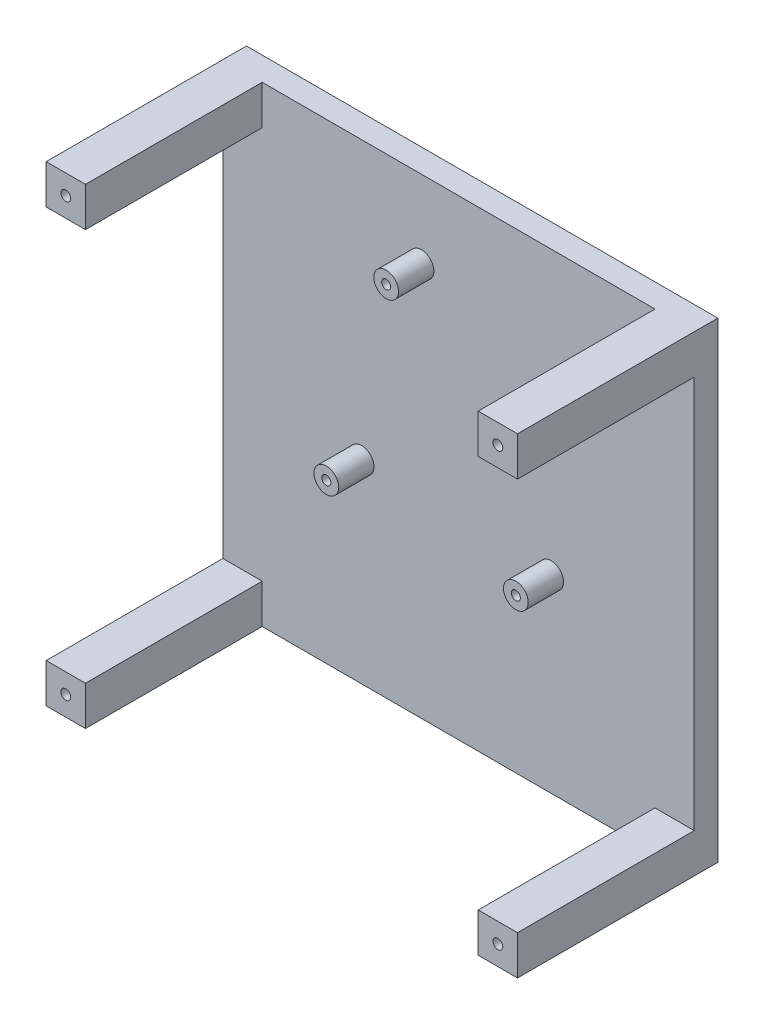
ISO-10303-21;
HEADER;
FILE_DESCRIPTION(('STEP AP214'),'2;1');
FILE_NAME('part.step','',(''),(''),'','','');
FILE_SCHEMA(('AUTOMOTIVE_DESIGN { 1 0 10303 214 1 1 1 1 }'));
ENDSEC;
DATA;
#1=APPLICATION_CONTEXT('core data for automotive mechanical design processes');
#2=APPLICATION_PROTOCOL_DEFINITION('international standard','automotive_design',2000,#1);
#3=PRODUCT_CONTEXT('',#1,'mechanical');
#4=PRODUCT('Part','Part','',(#3));
#5=PRODUCT_RELATED_PRODUCT_CATEGORY('part','',(#4));
#6=PRODUCT_DEFINITION_FORMATION('','',#4);
#7=PRODUCT_DEFINITION_CONTEXT('part definition',#1,'design');
#8=PRODUCT_DEFINITION('design','',#6,#7);
#9=PRODUCT_DEFINITION_SHAPE('','',#8);
#10=(LENGTH_UNIT() NAMED_UNIT(*) SI_UNIT(.MILLI.,.METRE.));
#11=(NAMED_UNIT(*) PLANE_ANGLE_UNIT() SI_UNIT($,.RADIAN.));
#12=(NAMED_UNIT(*) SI_UNIT($,.STERADIAN.) SOLID_ANGLE_UNIT());
#13=UNCERTAINTY_MEASURE_WITH_UNIT(LENGTH_MEASURE(1.E-05),#10,'distance_accuracy_value','');
#14=(GEOMETRIC_REPRESENTATION_CONTEXT(3) GLOBAL_UNCERTAINTY_ASSIGNED_CONTEXT((#13)) GLOBAL_UNIT_ASSIGNED_CONTEXT((#10,
#11,#12)) REPRESENTATION_CONTEXT('',''));
#15=CARTESIAN_POINT('',(0.,0.,0.));
#16=DIRECTION('',(0.,0.,1.));
#17=DIRECTION('',(1.,0.,0.));
#18=AXIS2_PLACEMENT_3D('',#15,#16,#17);
#19=CARTESIAN_POINT('',(0.,0.,6.));
#20=DIRECTION('',(0.,0.,-1.));
#21=DIRECTION('',(-1.,0.,0.));
#22=AXIS2_PLACEMENT_3D('',#19,#20,#21);
#23=PLANE('',#22);
#24=CARTESIAN_POINT('',(-9.44055671550319,40.2161245033507,6.));
#25=DIRECTION('',(0.,0.,-1.));
#26=DIRECTION('',(-1.,0.,0.));
#27=AXIS2_PLACEMENT_3D('',#24,#25,#26);
#28=CIRCLE('',#27,3.15);
#29=CARTESIAN_POINT('',(-12.5905567155032,40.2161245033507,6.));
#30=VERTEX_POINT('',#29);
#31=EDGE_CURVE('E11',#30,#30,#28,.F.);
#32=ORIENTED_EDGE('',*,*,#31,.F.);
#33=EDGE_LOOP('',(#32));
#34=FACE_BOUND('',#33,.T.);
#35=CARTESIAN_POINT('',(23.5794432844968,-11.8538754966493,6.));
#36=DIRECTION('',(0.,0.,-1.));
#37=DIRECTION('',(-1.,0.,0.));
#38=AXIS2_PLACEMENT_3D('',#35,#36,#37);
#39=CIRCLE('',#38,3.15);
#40=CARTESIAN_POINT('',(20.4294432844968,-11.8538754966493,6.));
#41=VERTEX_POINT('',#40);
#42=EDGE_CURVE('E54',#41,#41,#39,.F.);
#43=ORIENTED_EDGE('',*,*,#42,.F.);
#44=EDGE_LOOP('',(#43));
#45=FACE_BOUND('',#44,.T.);
#46=CARTESIAN_POINT('',(-24.6805567155027,-10.5838754966493,6.));
#47=DIRECTION('',(0.,0.,-1.));
#48=DIRECTION('',(-1.,0.,0.));
#49=AXIS2_PLACEMENT_3D('',#46,#47,#48);
#50=CIRCLE('',#49,3.15);
#51=CARTESIAN_POINT('',(-27.8305567155027,-10.5838754966493,6.));
#52=VERTEX_POINT('',#51);
#53=EDGE_CURVE('E292',#52,#52,#50,.F.);
#54=ORIENTED_EDGE('',*,*,#53,.F.);
#55=EDGE_LOOP('',(#54));
#56=FACE_BOUND('',#55,.T.);
#57=DIRECTION('',(-1.,0.,0.));
#58=VECTOR('',#57,1.);
#59=CARTESIAN_POINT('',(-60.,-50.,6.));
#60=LINE('',#59,#58);
#61=CARTESIAN_POINT('',(-50.,-50.,6.));
#62=VERTEX_POINT('',#61);
#63=CARTESIAN_POINT('',(-60.,-50.,6.));
#64=VERTEX_POINT('',#63);
#65=EDGE_CURVE('E228',#62,#64,#60,.T.);
#66=ORIENTED_EDGE('',*,*,#65,.F.);
#67=DIRECTION('',(0.,1.,0.));
#68=VECTOR('',#67,1.);
#69=CARTESIAN_POINT('',(-50.,-60.,6.));
#70=LINE('',#69,#68);
#71=CARTESIAN_POINT('',(-50.,-60.,6.));
#72=VERTEX_POINT('',#71);
#73=EDGE_CURVE('E192',#72,#62,#70,.T.);
#74=ORIENTED_EDGE('',*,*,#73,.F.);
#75=DIRECTION('',(1.,0.,0.));
#76=VECTOR('',#75,1.);
#77=CARTESIAN_POINT('',(60.,-60.,6.));
#78=LINE('',#77,#76);
#79=CARTESIAN_POINT('',(50.,-60.,6.));
#80=VERTEX_POINT('',#79);
#81=EDGE_CURVE('E268',#72,#80,#78,.T.);
#82=ORIENTED_EDGE('',*,*,#81,.T.);
#83=DIRECTION('',(0.,-1.,0.));
#84=VECTOR('',#83,1.);
#85=CARTESIAN_POINT('',(50.,-60.,6.));
#86=LINE('',#85,#84);
#87=CARTESIAN_POINT('',(50.,-50.,6.));
#88=VERTEX_POINT('',#87);
#89=EDGE_CURVE('E204',#88,#80,#86,.T.);
#90=ORIENTED_EDGE('',*,*,#89,.F.);
#91=DIRECTION('',(-1.,0.,0.));
#92=VECTOR('',#91,1.);
#93=CARTESIAN_POINT('',(60.,-50.,6.));
#94=LINE('',#93,#92);
#95=CARTESIAN_POINT('',(60.,-50.,6.));
#96=VERTEX_POINT('',#95);
#97=EDGE_CURVE('E70',#96,#88,#94,.T.);
#98=ORIENTED_EDGE('',*,*,#97,.F.);
#99=DIRECTION('',(0.,1.,0.));
#100=VECTOR('',#99,1.);
#101=CARTESIAN_POINT('',(60.,-60.,6.));
#102=LINE('',#101,#100);
#103=CARTESIAN_POINT('',(60.,50.,6.));
#104=VERTEX_POINT('',#103);
#105=EDGE_CURVE('E61',#96,#104,#102,.T.);
#106=ORIENTED_EDGE('',*,*,#105,.T.);
#107=DIRECTION('',(1.,0.,0.));
#108=VECTOR('',#107,1.);
#109=CARTESIAN_POINT('',(60.,50.,6.));
#110=LINE('',#109,#108);
#111=CARTESIAN_POINT('',(50.,50.,6.));
#112=VERTEX_POINT('',#111);
#113=EDGE_CURVE('E153',#112,#104,#110,.T.);
#114=ORIENTED_EDGE('',*,*,#113,.F.);
#115=DIRECTION('',(0.,-1.,0.));
#116=VECTOR('',#115,1.);
#117=CARTESIAN_POINT('',(50.,60.,6.));
#118=LINE('',#117,#116);
#119=CARTESIAN_POINT('',(50.,60.,6.));
#120=VERTEX_POINT('',#119);
#121=EDGE_CURVE('E159',#120,#112,#118,.T.);
#122=ORIENTED_EDGE('',*,*,#121,.F.);
#123=DIRECTION('',(-1.,0.,0.));
#124=VECTOR('',#123,1.);
#125=CARTESIAN_POINT('',(60.,60.,6.));
#126=LINE('',#125,#124);
#127=CARTESIAN_POINT('',(-50.,60.,6.));
#128=VERTEX_POINT('',#127);
#129=EDGE_CURVE('E263',#120,#128,#126,.T.);
#130=ORIENTED_EDGE('',*,*,#129,.T.);
#131=DIRECTION('',(0.,1.,0.));
#132=VECTOR('',#131,1.);
#133=CARTESIAN_POINT('',(-50.,60.,6.));
#134=LINE('',#133,#132);
#135=CARTESIAN_POINT('',(-50.,50.,6.));
#136=VERTEX_POINT('',#135);
#137=EDGE_CURVE('E242',#136,#128,#134,.T.);
#138=ORIENTED_EDGE('',*,*,#137,.F.);
#139=DIRECTION('',(1.,0.,0.));
#140=VECTOR('',#139,1.);
#141=CARTESIAN_POINT('',(-60.,50.,6.));
#142=LINE('',#141,#140);
#143=CARTESIAN_POINT('',(-60.,50.,6.));
#144=VERTEX_POINT('',#143);
#145=EDGE_CURVE('E173',#144,#136,#142,.T.);
#146=ORIENTED_EDGE('',*,*,#145,.F.);
#147=DIRECTION('',(0.,-1.,0.));
#148=VECTOR('',#147,1.);
#149=CARTESIAN_POINT('',(-60.,-60.,6.));
#150=LINE('',#149,#148);
#151=EDGE_CURVE('E269',#144,#64,#150,.T.);
#152=ORIENTED_EDGE('',*,*,#151,.T.);
#153=EDGE_LOOP('',(#66,#74,#82,#90,#98,#106,#114,#122,#130,#138,#146,#152));
#154=FACE_BOUND('',#153,.T.);
#155=ADVANCED_FACE('F50',(#34,#45,#56,#154),#23,.F.);
#156=CARTESIAN_POINT('',(60.,60.,6.));
#157=DIRECTION('',(0.,-1.,0.));
#158=DIRECTION('',(0.,0.,-1.));
#159=AXIS2_PLACEMENT_3D('',#156,#157,#158);
#160=PLANE('',#159);
#161=DIRECTION('',(-1.,0.,0.));
#162=VECTOR('',#161,1.);
#163=CARTESIAN_POINT('',(60.,60.,0.));
#164=LINE('',#163,#162);
#165=CARTESIAN_POINT('',(60.,60.,0.));
#166=VERTEX_POINT('',#165);
#167=CARTESIAN_POINT('',(-60.,60.,0.));
#168=VERTEX_POINT('',#167);
#169=EDGE_CURVE('E261',#166,#168,#164,.T.);
#170=ORIENTED_EDGE('',*,*,#169,.T.);
#171=DIRECTION('',(0.,0.,-1.));
#172=VECTOR('',#171,1.);
#173=CARTESIAN_POINT('',(-60.,60.,6.));
#174=LINE('',#173,#172);
#175=CARTESIAN_POINT('',(-60.,60.,51.));
#176=VERTEX_POINT('',#175);
#177=EDGE_CURVE('E286',#176,#168,#174,.T.);
#178=ORIENTED_EDGE('',*,*,#177,.F.);
#179=DIRECTION('',(-1.,0.,0.));
#180=VECTOR('',#179,1.);
#181=CARTESIAN_POINT('',(-60.,60.,51.));
#182=LINE('',#181,#180);
#183=CARTESIAN_POINT('',(-50.,60.,51.));
#184=VERTEX_POINT('',#183);
#185=EDGE_CURVE('E247',#184,#176,#182,.T.);
#186=ORIENTED_EDGE('',*,*,#185,.F.);
#187=DIRECTION('',(0.,0.,-1.));
#188=VECTOR('',#187,1.);
#189=CARTESIAN_POINT('',(-50.,60.,51.));
#190=LINE('',#189,#188);
#191=EDGE_CURVE('E252',#184,#128,#190,.T.);
#192=ORIENTED_EDGE('',*,*,#191,.T.);
#193=ORIENTED_EDGE('',*,*,#129,.F.);
#194=DIRECTION('',(0.,0.,-1.));
#195=VECTOR('',#194,1.);
#196=CARTESIAN_POINT('',(50.,60.,51.));
#197=LINE('',#196,#195);
#198=CARTESIAN_POINT('',(50.,60.,51.));
#199=VERTEX_POINT('',#198);
#200=EDGE_CURVE('E175',#199,#120,#197,.T.);
#201=ORIENTED_EDGE('',*,*,#200,.F.);
#202=DIRECTION('',(-1.,0.,0.));
#203=VECTOR('',#202,1.);
#204=CARTESIAN_POINT('',(60.,60.,51.));
#205=LINE('',#204,#203);
#206=CARTESIAN_POINT('',(60.,60.,51.));
#207=VERTEX_POINT('',#206);
#208=EDGE_CURVE('E161',#207,#199,#205,.T.);
#209=ORIENTED_EDGE('',*,*,#208,.F.);
#210=DIRECTION('',(0.,0.,-1.));
#211=VECTOR('',#210,1.);
#212=CARTESIAN_POINT('',(60.,60.,6.));
#213=LINE('',#212,#211);
#214=EDGE_CURVE('E271',#207,#166,#213,.T.);
#215=ORIENTED_EDGE('',*,*,#214,.T.);
#216=EDGE_LOOP('',(#170,#178,#186,#192,#193,#201,#209,#215));
#217=FACE_BOUND('',#216,.T.);
#218=ADVANCED_FACE('F47',(#217),#160,.F.);
#219=CARTESIAN_POINT('',(-60.,-60.,6.));
#220=DIRECTION('',(1.,0.,0.));
#221=DIRECTION('',(0.,0.,-1.));
#222=AXIS2_PLACEMENT_3D('',#219,#220,#221);
#223=PLANE('',#222);
#224=DIRECTION('',(0.,-1.,0.));
#225=VECTOR('',#224,1.);
#226=CARTESIAN_POINT('',(-60.,-60.,0.));
#227=LINE('',#226,#225);
#228=CARTESIAN_POINT('',(-60.,-60.,0.));
#229=VERTEX_POINT('',#228);
#230=EDGE_CURVE('E279',#168,#229,#227,.T.);
#231=ORIENTED_EDGE('',*,*,#230,.T.);
#232=DIRECTION('',(0.,0.,-1.));
#233=VECTOR('',#232,1.);
#234=CARTESIAN_POINT('',(-60.,-60.,6.));
#235=LINE('',#234,#233);
#236=CARTESIAN_POINT('',(-60.,-60.,51.));
#237=VERTEX_POINT('',#236);
#238=EDGE_CURVE('E287',#237,#229,#235,.T.);
#239=ORIENTED_EDGE('',*,*,#238,.F.);
#240=DIRECTION('',(0.,-1.,0.));
#241=VECTOR('',#240,1.);
#242=CARTESIAN_POINT('',(-60.,-60.,51.));
#243=LINE('',#242,#241);
#244=CARTESIAN_POINT('',(-60.,-50.,51.));
#245=VERTEX_POINT('',#244);
#246=EDGE_CURVE('E223',#245,#237,#243,.T.);
#247=ORIENTED_EDGE('',*,*,#246,.F.);
#248=DIRECTION('',(0.,0.,-1.));
#249=VECTOR('',#248,1.);
#250=CARTESIAN_POINT('',(-60.,-50.,51.));
#251=LINE('',#250,#249);
#252=EDGE_CURVE('E224',#245,#64,#251,.T.);
#253=ORIENTED_EDGE('',*,*,#252,.T.);
#254=ORIENTED_EDGE('',*,*,#151,.F.);
#255=DIRECTION('',(0.,0.,-1.));
#256=VECTOR('',#255,1.);
#257=CARTESIAN_POINT('',(-60.,50.,51.));
#258=LINE('',#257,#256);
#259=CARTESIAN_POINT('',(-60.,50.,51.));
#260=VERTEX_POINT('',#259);
#261=EDGE_CURVE('E262',#260,#144,#258,.T.);
#262=ORIENTED_EDGE('',*,*,#261,.F.);
#263=DIRECTION('',(0.,-1.,0.));
#264=VECTOR('',#263,1.);
#265=CARTESIAN_POINT('',(-60.,60.,51.));
#266=LINE('',#265,#264);
#267=EDGE_CURVE('E239',#176,#260,#266,.T.);
#268=ORIENTED_EDGE('',*,*,#267,.F.);
#269=ORIENTED_EDGE('',*,*,#177,.T.);
#270=EDGE_LOOP('',(#231,#239,#247,#253,#254,#262,#268,#269));
#271=FACE_BOUND('',#270,.T.);
#272=ADVANCED_FACE('F406',(#271),#223,.F.);
#273=CARTESIAN_POINT('',(60.,-60.,6.));
#274=DIRECTION('',(0.,1.,0.));
#275=DIRECTION('',(0.,0.,1.));
#276=AXIS2_PLACEMENT_3D('',#273,#274,#275);
#277=PLANE('',#276);
#278=DIRECTION('',(1.,0.,0.));
#279=VECTOR('',#278,1.);
#280=CARTESIAN_POINT('',(60.,-60.,0.));
#281=LINE('',#280,#279);
#282=CARTESIAN_POINT('',(60.,-60.,0.));
#283=VERTEX_POINT('',#282);
#284=EDGE_CURVE('E280',#229,#283,#281,.T.);
#285=ORIENTED_EDGE('',*,*,#284,.T.);
#286=DIRECTION('',(0.,0.,-1.));
#287=VECTOR('',#286,1.);
#288=CARTESIAN_POINT('',(60.,-60.,6.));
#289=LINE('',#288,#287);
#290=CARTESIAN_POINT('',(60.,-60.,51.));
#291=VERTEX_POINT('',#290);
#292=EDGE_CURVE('E284',#291,#283,#289,.T.);
#293=ORIENTED_EDGE('',*,*,#292,.F.);
#294=DIRECTION('',(1.,0.,0.));
#295=VECTOR('',#294,1.);
#296=CARTESIAN_POINT('',(60.,-60.,51.));
#297=LINE('',#296,#295);
#298=CARTESIAN_POINT('',(50.,-60.,51.));
#299=VERTEX_POINT('',#298);
#300=EDGE_CURVE('E202',#299,#291,#297,.T.);
#301=ORIENTED_EDGE('',*,*,#300,.F.);
#302=DIRECTION('',(0.,0.,-1.));
#303=VECTOR('',#302,1.);
#304=CARTESIAN_POINT('',(50.,-60.,51.));
#305=LINE('',#304,#303);
#306=EDGE_CURVE('E199',#299,#80,#305,.T.);
#307=ORIENTED_EDGE('',*,*,#306,.T.);
#308=ORIENTED_EDGE('',*,*,#81,.F.);
#309=DIRECTION('',(0.,0.,-1.));
#310=VECTOR('',#309,1.);
#311=CARTESIAN_POINT('',(-50.,-60.,51.));
#312=LINE('',#311,#310);
#313=CARTESIAN_POINT('',(-50.,-60.,51.));
#314=VERTEX_POINT('',#313);
#315=EDGE_CURVE('E212',#314,#72,#312,.T.);
#316=ORIENTED_EDGE('',*,*,#315,.F.);
#317=DIRECTION('',(1.,0.,0.));
#318=VECTOR('',#317,1.);
#319=CARTESIAN_POINT('',(-60.,-60.,51.));
#320=LINE('',#319,#318);
#321=EDGE_CURVE('E230',#237,#314,#320,.T.);
#322=ORIENTED_EDGE('',*,*,#321,.F.);
#323=ORIENTED_EDGE('',*,*,#238,.T.);
#324=EDGE_LOOP('',(#285,#293,#301,#307,#308,#316,#322,#323));
#325=FACE_BOUND('',#324,.T.);
#326=ADVANCED_FACE('F404',(#325),#277,.F.);
#327=CARTESIAN_POINT('',(60.,-60.,6.));
#328=DIRECTION('',(-1.,0.,0.));
#329=DIRECTION('',(0.,0.,1.));
#330=AXIS2_PLACEMENT_3D('',#327,#328,#329);
#331=PLANE('',#330);
#332=DIRECTION('',(0.,1.,0.));
#333=VECTOR('',#332,1.);
#334=CARTESIAN_POINT('',(60.,-60.,0.));
#335=LINE('',#334,#333);
#336=EDGE_CURVE('E270',#283,#166,#335,.T.);
#337=ORIENTED_EDGE('',*,*,#336,.T.);
#338=ORIENTED_EDGE('',*,*,#214,.F.);
#339=DIRECTION('',(0.,1.,0.));
#340=VECTOR('',#339,1.);
#341=CARTESIAN_POINT('',(60.,60.,51.));
#342=LINE('',#341,#340);
#343=CARTESIAN_POINT('',(60.,50.,51.));
#344=VERTEX_POINT('',#343);
#345=EDGE_CURVE('E177',#344,#207,#342,.T.);
#346=ORIENTED_EDGE('',*,*,#345,.F.);
#347=DIRECTION('',(0.,0.,-1.));
#348=VECTOR('',#347,1.);
#349=CARTESIAN_POINT('',(60.,50.,51.));
#350=LINE('',#349,#348);
#351=EDGE_CURVE('E180',#344,#104,#350,.T.);
#352=ORIENTED_EDGE('',*,*,#351,.T.);
#353=ORIENTED_EDGE('',*,*,#105,.F.);
#354=DIRECTION('',(0.,0.,-1.));
#355=VECTOR('',#354,1.);
#356=CARTESIAN_POINT('',(60.,-50.,51.));
#357=LINE('',#356,#355);
#358=CARTESIAN_POINT('',(60.,-50.,51.));
#359=VERTEX_POINT('',#358);
#360=EDGE_CURVE('E194',#359,#96,#357,.T.);
#361=ORIENTED_EDGE('',*,*,#360,.F.);
#362=DIRECTION('',(0.,1.,0.));
#363=VECTOR('',#362,1.);
#364=CARTESIAN_POINT('',(60.,-60.,51.));
#365=LINE('',#364,#363);
#366=EDGE_CURVE('E203',#291,#359,#365,.T.);
#367=ORIENTED_EDGE('',*,*,#366,.F.);
#368=ORIENTED_EDGE('',*,*,#292,.T.);
#369=EDGE_LOOP('',(#337,#338,#346,#352,#353,#361,#367,#368));
#370=FACE_BOUND('',#369,.T.);
#371=ADVANCED_FACE('F398',(#370),#331,.F.);
#372=CARTESIAN_POINT('',(0.,0.,0.));
#373=DIRECTION('',(0.,0.,-1.));
#374=DIRECTION('',(-1.,0.,0.));
#375=AXIS2_PLACEMENT_3D('',#372,#373,#374);
#376=PLANE('',#375);
#377=ORIENTED_EDGE('',*,*,#169,.F.);
#378=ORIENTED_EDGE('',*,*,#336,.F.);
#379=ORIENTED_EDGE('',*,*,#284,.F.);
#380=ORIENTED_EDGE('',*,*,#230,.F.);
#381=EDGE_LOOP('',(#377,#378,#379,#380));
#382=FACE_BOUND('',#381,.T.);
#383=ADVANCED_FACE('F393',(#382),#376,.T.);
#384=CARTESIAN_POINT('',(-60.,50.,51.));
#385=DIRECTION('',(0.,1.,0.));
#386=DIRECTION('',(0.,0.,1.));
#387=AXIS2_PLACEMENT_3D('',#384,#385,#386);
#388=PLANE('',#387);
#389=ORIENTED_EDGE('',*,*,#145,.T.);
#390=DIRECTION('',(0.,0.,-1.));
#391=VECTOR('',#390,1.);
#392=CARTESIAN_POINT('',(-50.,50.,51.));
#393=LINE('',#392,#391);
#394=CARTESIAN_POINT('',(-50.,50.,51.));
#395=VERTEX_POINT('',#394);
#396=EDGE_CURVE('E260',#395,#136,#393,.T.);
#397=ORIENTED_EDGE('',*,*,#396,.F.);
#398=DIRECTION('',(1.,0.,0.));
#399=VECTOR('',#398,1.);
#400=CARTESIAN_POINT('',(-60.,50.,51.));
#401=LINE('',#400,#399);
#402=EDGE_CURVE('E243',#260,#395,#401,.T.);
#403=ORIENTED_EDGE('',*,*,#402,.F.);
#404=ORIENTED_EDGE('',*,*,#261,.T.);
#405=EDGE_LOOP('',(#389,#397,#403,#404));
#406=FACE_BOUND('',#405,.T.);
#407=ADVANCED_FACE('F395',(#406),#388,.F.);
#408=CARTESIAN_POINT('',(-50.,60.,51.));
#409=DIRECTION('',(-1.,0.,0.));
#410=DIRECTION('',(0.,0.,1.));
#411=AXIS2_PLACEMENT_3D('',#408,#409,#410);
#412=PLANE('',#411);
#413=ORIENTED_EDGE('',*,*,#137,.T.);
#414=ORIENTED_EDGE('',*,*,#191,.F.);
#415=DIRECTION('',(0.,1.,0.));
#416=VECTOR('',#415,1.);
#417=CARTESIAN_POINT('',(-50.,60.,51.));
#418=LINE('',#417,#416);
#419=EDGE_CURVE('E246',#395,#184,#418,.T.);
#420=ORIENTED_EDGE('',*,*,#419,.F.);
#421=ORIENTED_EDGE('',*,*,#396,.T.);
#422=EDGE_LOOP('',(#413,#414,#420,#421));
#423=FACE_BOUND('',#422,.T.);
#424=ADVANCED_FACE('F390',(#423),#412,.F.);
#425=CARTESIAN_POINT('',(0.,0.,51.));
#426=DIRECTION('',(0.,0.,1.));
#427=DIRECTION('',(1.,0.,0.));
#428=AXIS2_PLACEMENT_3D('',#425,#426,#427);
#429=PLANE('',#428);
#430=CARTESIAN_POINT('',(-55.,55.,51.));
#431=DIRECTION('',(0.,0.,1.));
#432=DIRECTION('',(1.,0.,0.));
#433=AXIS2_PLACEMENT_3D('',#430,#431,#432);
#434=CIRCLE('',#433,1.25);
#435=CARTESIAN_POINT('',(-53.75,55.,51.));
#436=VERTEX_POINT('',#435);
#437=EDGE_CURVE('E767',#436,#436,#434,.T.);
#438=ORIENTED_EDGE('',*,*,#437,.F.);
#439=EDGE_LOOP('',(#438));
#440=FACE_BOUND('',#439,.T.);
#441=ORIENTED_EDGE('',*,*,#267,.T.);
#442=ORIENTED_EDGE('',*,*,#402,.T.);
#443=ORIENTED_EDGE('',*,*,#419,.T.);
#444=ORIENTED_EDGE('',*,*,#185,.T.);
#445=EDGE_LOOP('',(#441,#442,#443,#444));
#446=FACE_BOUND('',#445,.T.);
#447=ADVANCED_FACE('F358',(#440,#446),#429,.T.);
#448=CARTESIAN_POINT('',(50.,60.,51.));
#449=DIRECTION('',(1.,0.,0.));
#450=DIRECTION('',(0.,0.,-1.));
#451=AXIS2_PLACEMENT_3D('',#448,#449,#450);
#452=PLANE('',#451);
#453=ORIENTED_EDGE('',*,*,#121,.T.);
#454=DIRECTION('',(0.,0.,-1.));
#455=VECTOR('',#454,1.);
#456=CARTESIAN_POINT('',(50.,50.,51.));
#457=LINE('',#456,#455);
#458=CARTESIAN_POINT('',(50.,50.,51.));
#459=VERTEX_POINT('',#458);
#460=EDGE_CURVE('E169',#459,#112,#457,.T.);
#461=ORIENTED_EDGE('',*,*,#460,.F.);
#462=DIRECTION('',(0.,-1.,0.));
#463=VECTOR('',#462,1.);
#464=CARTESIAN_POINT('',(50.,60.,51.));
#465=LINE('',#464,#463);
#466=EDGE_CURVE('E190',#199,#459,#465,.T.);
#467=ORIENTED_EDGE('',*,*,#466,.F.);
#468=ORIENTED_EDGE('',*,*,#200,.T.);
#469=EDGE_LOOP('',(#453,#461,#467,#468));
#470=FACE_BOUND('',#469,.T.);
#471=ADVANCED_FACE('F166',(#470),#452,.F.);
#472=CARTESIAN_POINT('',(60.,50.,51.));
#473=DIRECTION('',(0.,1.,0.));
#474=DIRECTION('',(0.,0.,1.));
#475=AXIS2_PLACEMENT_3D('',#472,#473,#474);
#476=PLANE('',#475);
#477=ORIENTED_EDGE('',*,*,#113,.T.);
#478=ORIENTED_EDGE('',*,*,#351,.F.);
#479=DIRECTION('',(1.,0.,0.));
#480=VECTOR('',#479,1.);
#481=CARTESIAN_POINT('',(60.,50.,51.));
#482=LINE('',#481,#480);
#483=EDGE_CURVE('E176',#459,#344,#482,.T.);
#484=ORIENTED_EDGE('',*,*,#483,.F.);
#485=ORIENTED_EDGE('',*,*,#460,.T.);
#486=EDGE_LOOP('',(#477,#478,#484,#485));
#487=FACE_BOUND('',#486,.T.);
#488=ADVANCED_FACE('F174',(#487),#476,.F.);
#489=CARTESIAN_POINT('',(0.,0.,51.));
#490=DIRECTION('',(0.,0.,1.));
#491=DIRECTION('',(1.,0.,0.));
#492=AXIS2_PLACEMENT_3D('',#489,#490,#491);
#493=PLANE('',#492);
#494=CARTESIAN_POINT('',(55.,55.,51.));
#495=DIRECTION('',(0.,0.,-1.));
#496=DIRECTION('',(-1.,0.,0.));
#497=AXIS2_PLACEMENT_3D('',#494,#495,#496);
#498=CIRCLE('',#497,1.25);
#499=CARTESIAN_POINT('',(53.75,55.,51.));
#500=VERTEX_POINT('',#499);
#501=EDGE_CURVE('E765',#500,#500,#498,.T.);
#502=ORIENTED_EDGE('',*,*,#501,.T.);
#503=EDGE_LOOP('',(#502));
#504=FACE_BOUND('',#503,.T.);
#505=ORIENTED_EDGE('',*,*,#208,.T.);
#506=ORIENTED_EDGE('',*,*,#466,.T.);
#507=ORIENTED_EDGE('',*,*,#483,.T.);
#508=ORIENTED_EDGE('',*,*,#345,.T.);
#509=EDGE_LOOP('',(#505,#506,#507,#508));
#510=FACE_BOUND('',#509,.T.);
#511=ADVANCED_FACE('F360',(#504,#510),#493,.T.);
#512=CARTESIAN_POINT('',(60.,-50.,51.));
#513=DIRECTION('',(0.,-1.,0.));
#514=DIRECTION('',(0.,0.,-1.));
#515=AXIS2_PLACEMENT_3D('',#512,#513,#514);
#516=PLANE('',#515);
#517=ORIENTED_EDGE('',*,*,#97,.T.);
#518=DIRECTION('',(0.,0.,-1.));
#519=VECTOR('',#518,1.);
#520=CARTESIAN_POINT('',(50.,-50.,51.));
#521=LINE('',#520,#519);
#522=CARTESIAN_POINT('',(50.,-50.,51.));
#523=VERTEX_POINT('',#522);
#524=EDGE_CURVE('E193',#523,#88,#521,.T.);
#525=ORIENTED_EDGE('',*,*,#524,.F.);
#526=DIRECTION('',(-1.,0.,0.));
#527=VECTOR('',#526,1.);
#528=CARTESIAN_POINT('',(60.,-50.,51.));
#529=LINE('',#528,#527);
#530=EDGE_CURVE('E214',#359,#523,#529,.T.);
#531=ORIENTED_EDGE('',*,*,#530,.F.);
#532=ORIENTED_EDGE('',*,*,#360,.T.);
#533=EDGE_LOOP('',(#517,#525,#531,#532));
#534=FACE_BOUND('',#533,.T.);
#535=ADVANCED_FACE('F365',(#534),#516,.F.);
#536=CARTESIAN_POINT('',(50.,-60.,51.));
#537=DIRECTION('',(1.,0.,0.));
#538=DIRECTION('',(0.,0.,-1.));
#539=AXIS2_PLACEMENT_3D('',#536,#537,#538);
#540=PLANE('',#539);
#541=ORIENTED_EDGE('',*,*,#89,.T.);
#542=ORIENTED_EDGE('',*,*,#306,.F.);
#543=DIRECTION('',(0.,-1.,0.));
#544=VECTOR('',#543,1.);
#545=CARTESIAN_POINT('',(50.,-60.,51.));
#546=LINE('',#545,#544);
#547=EDGE_CURVE('E209',#523,#299,#546,.T.);
#548=ORIENTED_EDGE('',*,*,#547,.F.);
#549=ORIENTED_EDGE('',*,*,#524,.T.);
#550=EDGE_LOOP('',(#541,#542,#548,#549));
#551=FACE_BOUND('',#550,.T.);
#552=ADVANCED_FACE('F366',(#551),#540,.F.);
#553=CARTESIAN_POINT('',(0.,0.,51.));
#554=DIRECTION('',(0.,0.,1.));
#555=DIRECTION('',(1.,0.,0.));
#556=AXIS2_PLACEMENT_3D('',#553,#554,#555);
#557=PLANE('',#556);
#558=CARTESIAN_POINT('',(55.,-55.,51.));
#559=DIRECTION('',(0.,0.,1.));
#560=DIRECTION('',(-1.,0.,0.));
#561=AXIS2_PLACEMENT_3D('',#558,#559,#560);
#562=CIRCLE('',#561,1.25);
#563=CARTESIAN_POINT('',(53.75,-55.,51.));
#564=VERTEX_POINT('',#563);
#565=EDGE_CURVE('E743',#564,#564,#562,.T.);
#566=ORIENTED_EDGE('',*,*,#565,.F.);
#567=EDGE_LOOP('',(#566));
#568=FACE_BOUND('',#567,.T.);
#569=ORIENTED_EDGE('',*,*,#366,.T.);
#570=ORIENTED_EDGE('',*,*,#530,.T.);
#571=ORIENTED_EDGE('',*,*,#547,.T.);
#572=ORIENTED_EDGE('',*,*,#300,.T.);
#573=EDGE_LOOP('',(#569,#570,#571,#572));
#574=FACE_BOUND('',#573,.T.);
#575=ADVANCED_FACE('F369',(#568,#574),#557,.T.);
#576=CARTESIAN_POINT('',(-50.,-60.,51.));
#577=DIRECTION('',(-1.,0.,0.));
#578=DIRECTION('',(0.,0.,1.));
#579=AXIS2_PLACEMENT_3D('',#576,#577,#578);
#580=PLANE('',#579);
#581=ORIENTED_EDGE('',*,*,#73,.T.);
#582=DIRECTION('',(0.,0.,-1.));
#583=VECTOR('',#582,1.);
#584=CARTESIAN_POINT('',(-50.,-50.,51.));
#585=LINE('',#584,#583);
#586=CARTESIAN_POINT('',(-50.,-50.,51.));
#587=VERTEX_POINT('',#586);
#588=EDGE_CURVE('E219',#587,#62,#585,.T.);
#589=ORIENTED_EDGE('',*,*,#588,.F.);
#590=DIRECTION('',(0.,1.,0.));
#591=VECTOR('',#590,1.);
#592=CARTESIAN_POINT('',(-50.,-60.,51.));
#593=LINE('',#592,#591);
#594=EDGE_CURVE('E236',#314,#587,#593,.T.);
#595=ORIENTED_EDGE('',*,*,#594,.F.);
#596=ORIENTED_EDGE('',*,*,#315,.T.);
#597=EDGE_LOOP('',(#581,#589,#595,#596));
#598=FACE_BOUND('',#597,.T.);
#599=ADVANCED_FACE('F372',(#598),#580,.F.);
#600=CARTESIAN_POINT('',(-60.,-50.,51.));
#601=DIRECTION('',(0.,-1.,0.));
#602=DIRECTION('',(0.,0.,-1.));
#603=AXIS2_PLACEMENT_3D('',#600,#601,#602);
#604=PLANE('',#603);
#605=ORIENTED_EDGE('',*,*,#65,.T.);
#606=ORIENTED_EDGE('',*,*,#252,.F.);
#607=DIRECTION('',(-1.,0.,0.));
#608=VECTOR('',#607,1.);
#609=CARTESIAN_POINT('',(-60.,-50.,51.));
#610=LINE('',#609,#608);
#611=EDGE_CURVE('E234',#587,#245,#610,.T.);
#612=ORIENTED_EDGE('',*,*,#611,.F.);
#613=ORIENTED_EDGE('',*,*,#588,.T.);
#614=EDGE_LOOP('',(#605,#606,#612,#613));
#615=FACE_BOUND('',#614,.T.);
#616=ADVANCED_FACE('F377',(#615),#604,.F.);
#617=CARTESIAN_POINT('',(0.,0.,51.));
#618=DIRECTION('',(0.,0.,1.));
#619=DIRECTION('',(1.,0.,0.));
#620=AXIS2_PLACEMENT_3D('',#617,#618,#619);
#621=PLANE('',#620);
#622=CARTESIAN_POINT('',(-55.,-55.,51.));
#623=DIRECTION('',(0.,0.,-1.));
#624=DIRECTION('',(1.,0.,0.));
#625=AXIS2_PLACEMENT_3D('',#622,#623,#624);
#626=CIRCLE('',#625,1.25);
#627=CARTESIAN_POINT('',(-53.75,-55.,51.));
#628=VERTEX_POINT('',#627);
#629=EDGE_CURVE('E756',#628,#628,#626,.T.);
#630=ORIENTED_EDGE('',*,*,#629,.T.);
#631=EDGE_LOOP('',(#630));
#632=FACE_BOUND('',#631,.T.);
#633=ORIENTED_EDGE('',*,*,#321,.T.);
#634=ORIENTED_EDGE('',*,*,#594,.T.);
#635=ORIENTED_EDGE('',*,*,#611,.T.);
#636=ORIENTED_EDGE('',*,*,#246,.T.);
#637=EDGE_LOOP('',(#633,#634,#635,#636));
#638=FACE_BOUND('',#637,.T.);
#639=ADVANCED_FACE('F354',(#632,#638),#621,.T.);
#640=CARTESIAN_POINT('',(-55.,55.,37.));
#641=DIRECTION('',(0.,0.,1.));
#642=DIRECTION('',(1.,0.,0.));
#643=AXIS2_PLACEMENT_3D('',#640,#641,#642);
#644=CYLINDRICAL_SURFACE('',#643,1.25);
#645=CARTESIAN_POINT('',(-55.,55.,37.));
#646=DIRECTION('',(0.,0.,1.));
#647=DIRECTION('',(1.,0.,0.));
#648=AXIS2_PLACEMENT_3D('',#645,#646,#647);
#649=CIRCLE('',#648,1.25);
#650=CARTESIAN_POINT('',(-53.75,55.,37.));
#651=VERTEX_POINT('',#650);
#652=EDGE_CURVE('E216',#651,#651,#649,.T.);
#653=ORIENTED_EDGE('',*,*,#652,.F.);
#654=EDGE_LOOP('',(#653));
#655=FACE_BOUND('',#654,.T.);
#656=ORIENTED_EDGE('',*,*,#437,.T.);
#657=EDGE_LOOP('',(#656));
#658=FACE_BOUND('',#657,.T.);
#659=ADVANCED_FACE('F349',(#655,#658),#644,.F.);
#660=CARTESIAN_POINT('',(-55.,55.,37.));
#661=DIRECTION('',(0.,0.,1.));
#662=DIRECTION('',(1.,0.,0.));
#663=AXIS2_PLACEMENT_3D('',#660,#661,#662);
#664=PLANE('',#663);
#665=ORIENTED_EDGE('',*,*,#652,.T.);
#666=EDGE_LOOP('',(#665));
#667=FACE_BOUND('',#666,.T.);
#668=ADVANCED_FACE('F343',(#667),#664,.T.);
#669=CARTESIAN_POINT('',(55.,55.,37.));
#670=DIRECTION('',(0.,0.,1.));
#671=DIRECTION('',(1.,0.,0.));
#672=AXIS2_PLACEMENT_3D('',#669,#670,#671);
#673=CYLINDRICAL_SURFACE('',#672,1.25);
#674=CARTESIAN_POINT('',(55.,55.,37.));
#675=DIRECTION('',(0.,0.,-1.));
#676=DIRECTION('',(-1.,0.,0.));
#677=AXIS2_PLACEMENT_3D('',#674,#675,#676);
#678=CIRCLE('',#677,1.25);
#679=CARTESIAN_POINT('',(53.75,55.,37.));
#680=VERTEX_POINT('',#679);
#681=EDGE_CURVE('E764',#680,#680,#678,.T.);
#682=ORIENTED_EDGE('',*,*,#681,.T.);
#683=EDGE_LOOP('',(#682));
#684=FACE_BOUND('',#683,.T.);
#685=ORIENTED_EDGE('',*,*,#501,.F.);
#686=EDGE_LOOP('',(#685));
#687=FACE_BOUND('',#686,.T.);
#688=ADVANCED_FACE('F338',(#684,#687),#673,.F.);
#689=CARTESIAN_POINT('',(55.,55.,37.));
#690=DIRECTION('',(0.,0.,1.));
#691=DIRECTION('',(-1.,0.,0.));
#692=AXIS2_PLACEMENT_3D('',#689,#690,#691);
#693=PLANE('',#692);
#694=ORIENTED_EDGE('',*,*,#681,.F.);
#695=EDGE_LOOP('',(#694));
#696=FACE_BOUND('',#695,.T.);
#697=ADVANCED_FACE('F337',(#696),#693,.T.);
#698=CARTESIAN_POINT('',(-55.,-55.,37.));
#699=DIRECTION('',(0.,0.,1.));
#700=DIRECTION('',(1.,0.,0.));
#701=AXIS2_PLACEMENT_3D('',#698,#699,#700);
#702=CYLINDRICAL_SURFACE('',#701,1.25);
#703=CARTESIAN_POINT('',(-55.,-55.,37.));
#704=DIRECTION('',(0.,0.,-1.));
#705=DIRECTION('',(1.,0.,0.));
#706=AXIS2_PLACEMENT_3D('',#703,#704,#705);
#707=CIRCLE('',#706,1.25);
#708=CARTESIAN_POINT('',(-53.75,-55.,37.));
#709=VERTEX_POINT('',#708);
#710=EDGE_CURVE('E757',#709,#709,#707,.T.);
#711=ORIENTED_EDGE('',*,*,#710,.T.);
#712=EDGE_LOOP('',(#711));
#713=FACE_BOUND('',#712,.T.);
#714=ORIENTED_EDGE('',*,*,#629,.F.);
#715=EDGE_LOOP('',(#714));
#716=FACE_BOUND('',#715,.T.);
#717=ADVANCED_FACE('F334',(#713,#716),#702,.F.);
#718=CARTESIAN_POINT('',(-55.,-55.,37.));
#719=DIRECTION('',(0.,0.,1.));
#720=DIRECTION('',(1.,0.,0.));
#721=AXIS2_PLACEMENT_3D('',#718,#719,#720);
#722=PLANE('',#721);
#723=ORIENTED_EDGE('',*,*,#710,.F.);
#724=EDGE_LOOP('',(#723));
#725=FACE_BOUND('',#724,.T.);
#726=ADVANCED_FACE('F329',(#725),#722,.T.);
#727=CARTESIAN_POINT('',(55.,-55.,37.));
#728=DIRECTION('',(0.,0.,1.));
#729=DIRECTION('',(1.,0.,0.));
#730=AXIS2_PLACEMENT_3D('',#727,#728,#729);
#731=CYLINDRICAL_SURFACE('',#730,1.25);
#732=CARTESIAN_POINT('',(55.,-55.,37.));
#733=DIRECTION('',(0.,0.,1.));
#734=DIRECTION('',(-1.,0.,0.));
#735=AXIS2_PLACEMENT_3D('',#732,#733,#734);
#736=CIRCLE('',#735,1.25);
#737=CARTESIAN_POINT('',(53.75,-55.,37.));
#738=VERTEX_POINT('',#737);
#739=EDGE_CURVE('E751',#738,#738,#736,.T.);
#740=ORIENTED_EDGE('',*,*,#739,.F.);
#741=EDGE_LOOP('',(#740));
#742=FACE_BOUND('',#741,.T.);
#743=ORIENTED_EDGE('',*,*,#565,.T.);
#744=EDGE_LOOP('',(#743));
#745=FACE_BOUND('',#744,.T.);
#746=ADVANCED_FACE('F319',(#742,#745),#731,.F.);
#747=CARTESIAN_POINT('',(55.,-55.,37.));
#748=DIRECTION('',(0.,0.,1.));
#749=DIRECTION('',(-1.,0.,0.));
#750=AXIS2_PLACEMENT_3D('',#747,#748,#749);
#751=PLANE('',#750);
#752=ORIENTED_EDGE('',*,*,#739,.T.);
#753=EDGE_LOOP('',(#752));
#754=FACE_BOUND('',#753,.T.);
#755=ADVANCED_FACE('F308',(#754),#751,.T.);
#756=CARTESIAN_POINT('',(-24.6805567155027,-10.5838754966493,15.));
#757=DIRECTION('',(0.,0.,-1.));
#758=DIRECTION('',(-1.,0.,0.));
#759=AXIS2_PLACEMENT_3D('',#756,#757,#758);
#760=CYLINDRICAL_SURFACE('',#759,3.15);
#761=CARTESIAN_POINT('',(-24.6805567155027,-10.5838754966493,15.));
#762=DIRECTION('',(0.,0.,1.));
#763=DIRECTION('',(1.,0.,0.));
#764=AXIS2_PLACEMENT_3D('',#761,#762,#763);
#765=CIRCLE('',#764,3.15);
#766=CARTESIAN_POINT('',(-21.5305567155027,-10.5838754966493,15.));
#767=VERTEX_POINT('',#766);
#768=EDGE_CURVE('E750',#767,#767,#765,.T.);
#769=ORIENTED_EDGE('',*,*,#768,.F.);
#770=EDGE_LOOP('',(#769));
#771=FACE_BOUND('',#770,.T.);
#772=ORIENTED_EDGE('',*,*,#53,.T.);
#773=EDGE_LOOP('',(#772));
#774=FACE_BOUND('',#773,.T.);
#775=ADVANCED_FACE('F304',(#771,#774),#760,.T.);
#776=CARTESIAN_POINT('',(0.,0.,15.));
#777=DIRECTION('',(0.,0.,1.));
#778=DIRECTION('',(1.,0.,0.));
#779=AXIS2_PLACEMENT_3D('',#776,#777,#778);
#780=PLANE('',#779);
#781=CARTESIAN_POINT('',(-24.6805567155027,-10.5838754966493,15.));
#782=DIRECTION('',(0.,0.,1.));
#783=DIRECTION('',(1.,0.,0.));
#784=AXIS2_PLACEMENT_3D('',#781,#782,#783);
#785=CIRCLE('',#784,1.15);
#786=CARTESIAN_POINT('',(-23.5305567155027,-10.5838754966493,15.));
#787=VERTEX_POINT('',#786);
#788=EDGE_CURVE('E732',#787,#787,#785,.T.);
#789=ORIENTED_EDGE('',*,*,#788,.F.);
#790=EDGE_LOOP('',(#789));
#791=FACE_BOUND('',#790,.T.);
#792=ORIENTED_EDGE('',*,*,#768,.T.);
#793=EDGE_LOOP('',(#792));
#794=FACE_BOUND('',#793,.T.);
#795=ADVANCED_FACE('F310',(#791,#794),#780,.T.);
#796=CARTESIAN_POINT('',(23.5794432844968,-11.8538754966493,15.));
#797=DIRECTION('',(0.,0.,-1.));
#798=DIRECTION('',(-1.,0.,0.));
#799=AXIS2_PLACEMENT_3D('',#796,#797,#798);
#800=CYLINDRICAL_SURFACE('',#799,3.15);
#801=CARTESIAN_POINT('',(23.5794432844968,-11.8538754966493,15.));
#802=DIRECTION('',(0.,0.,1.));
#803=DIRECTION('',(1.,0.,0.));
#804=AXIS2_PLACEMENT_3D('',#801,#802,#803);
#805=CIRCLE('',#804,3.15);
#806=CARTESIAN_POINT('',(26.7294432844968,-11.8538754966493,15.));
#807=VERTEX_POINT('',#806);
#808=EDGE_CURVE('E748',#807,#807,#805,.T.);
#809=ORIENTED_EDGE('',*,*,#808,.F.);
#810=EDGE_LOOP('',(#809));
#811=FACE_BOUND('',#810,.T.);
#812=ORIENTED_EDGE('',*,*,#42,.T.);
#813=EDGE_LOOP('',(#812));
#814=FACE_BOUND('',#813,.T.);
#815=ADVANCED_FACE('F300',(#811,#814),#800,.T.);
#816=CARTESIAN_POINT('',(0.,0.,15.));
#817=DIRECTION('',(0.,0.,1.));
#818=DIRECTION('',(1.,0.,0.));
#819=AXIS2_PLACEMENT_3D('',#816,#817,#818);
#820=PLANE('',#819);
#821=CARTESIAN_POINT('',(23.5794432844968,-11.8538754966493,15.));
#822=DIRECTION('',(0.,0.,1.));
#823=DIRECTION('',(1.,0.,0.));
#824=AXIS2_PLACEMENT_3D('',#821,#822,#823);
#825=CIRCLE('',#824,1.15);
#826=CARTESIAN_POINT('',(24.7294432844968,-11.8538754966493,15.));
#827=VERTEX_POINT('',#826);
#828=EDGE_CURVE('E792',#827,#827,#825,.T.);
#829=ORIENTED_EDGE('',*,*,#828,.F.);
#830=EDGE_LOOP('',(#829));
#831=FACE_BOUND('',#830,.T.);
#832=ORIENTED_EDGE('',*,*,#808,.T.);
#833=EDGE_LOOP('',(#832));
#834=FACE_BOUND('',#833,.T.);
#835=ADVANCED_FACE('F325',(#831,#834),#820,.T.);
#836=CARTESIAN_POINT('',(-9.44055671550319,40.2161245033507,15.));
#837=DIRECTION('',(0.,0.,-1.));
#838=DIRECTION('',(-1.,0.,0.));
#839=AXIS2_PLACEMENT_3D('',#836,#837,#838);
#840=CYLINDRICAL_SURFACE('',#839,3.15);
#841=CARTESIAN_POINT('',(-9.44055671550319,40.2161245033507,15.));
#842=DIRECTION('',(0.,0.,1.));
#843=DIRECTION('',(1.,0.,0.));
#844=AXIS2_PLACEMENT_3D('',#841,#842,#843);
#845=CIRCLE('',#844,3.15);
#846=CARTESIAN_POINT('',(-6.29055671550319,40.2161245033507,15.));
#847=VERTEX_POINT('',#846);
#848=EDGE_CURVE('E744',#847,#847,#845,.T.);
#849=ORIENTED_EDGE('',*,*,#848,.F.);
#850=EDGE_LOOP('',(#849));
#851=FACE_BOUND('',#850,.T.);
#852=ORIENTED_EDGE('',*,*,#31,.T.);
#853=EDGE_LOOP('',(#852));
#854=FACE_BOUND('',#853,.T.);
#855=ADVANCED_FACE('F643',(#851,#854),#840,.T.);
#856=CARTESIAN_POINT('',(0.,0.,15.));
#857=DIRECTION('',(0.,0.,1.));
#858=DIRECTION('',(1.,0.,0.));
#859=AXIS2_PLACEMENT_3D('',#856,#857,#858);
#860=PLANE('',#859);
#861=CARTESIAN_POINT('',(-9.44055671550319,40.2161245033507,15.));
#862=DIRECTION('',(0.,0.,1.));
#863=DIRECTION('',(1.,0.,0.));
#864=AXIS2_PLACEMENT_3D('',#861,#862,#863);
#865=CIRCLE('',#864,1.15);
#866=CARTESIAN_POINT('',(-8.2905567155032,40.2161245033507,15.));
#867=VERTEX_POINT('',#866);
#868=EDGE_CURVE('E789',#867,#867,#865,.T.);
#869=ORIENTED_EDGE('',*,*,#868,.F.);
#870=EDGE_LOOP('',(#869));
#871=FACE_BOUND('',#870,.T.);
#872=ORIENTED_EDGE('',*,*,#848,.T.);
#873=EDGE_LOOP('',(#872));
#874=FACE_BOUND('',#873,.T.);
#875=ADVANCED_FACE('F659',(#871,#874),#860,.T.);
#876=CARTESIAN_POINT('',(-9.44055671550319,40.2161245033507,6.));
#877=DIRECTION('',(0.,0.,1.));
#878=DIRECTION('',(1.,0.,0.));
#879=AXIS2_PLACEMENT_3D('',#876,#877,#878);
#880=CYLINDRICAL_SURFACE('',#879,1.15);
#881=CARTESIAN_POINT('',(-9.44055671550319,40.2161245033507,6.));
#882=DIRECTION('',(0.,0.,1.));
#883=DIRECTION('',(1.,0.,0.));
#884=AXIS2_PLACEMENT_3D('',#881,#882,#883);
#885=CIRCLE('',#884,1.15);
#886=CARTESIAN_POINT('',(-8.2905567155032,40.2161245033507,6.));
#887=VERTEX_POINT('',#886);
#888=EDGE_CURVE('E755',#887,#887,#885,.T.);
#889=ORIENTED_EDGE('',*,*,#888,.F.);
#890=EDGE_LOOP('',(#889));
#891=FACE_BOUND('',#890,.T.);
#892=ORIENTED_EDGE('',*,*,#868,.T.);
#893=EDGE_LOOP('',(#892));
#894=FACE_BOUND('',#893,.T.);
#895=ADVANCED_FACE('F669',(#891,#894),#880,.F.);
#896=CARTESIAN_POINT('',(-9.44055671550319,40.2161245033507,6.));
#897=DIRECTION('',(0.,0.,1.));
#898=DIRECTION('',(1.,0.,0.));
#899=AXIS2_PLACEMENT_3D('',#896,#897,#898);
#900=PLANE('',#899);
#901=ORIENTED_EDGE('',*,*,#888,.T.);
#902=EDGE_LOOP('',(#901));
#903=FACE_BOUND('',#902,.T.);
#904=ADVANCED_FACE('F676',(#903),#900,.T.);
#905=CARTESIAN_POINT('',(23.5794432844968,-11.8538754966493,6.));
#906=DIRECTION('',(0.,0.,1.));
#907=DIRECTION('',(1.,0.,0.));
#908=AXIS2_PLACEMENT_3D('',#905,#906,#907);
#909=CYLINDRICAL_SURFACE('',#908,1.15);
#910=CARTESIAN_POINT('',(23.5794432844968,-11.8538754966493,6.));
#911=DIRECTION('',(0.,0.,1.));
#912=DIRECTION('',(1.,0.,0.));
#913=AXIS2_PLACEMENT_3D('',#910,#911,#912);
#914=CIRCLE('',#913,1.15);
#915=CARTESIAN_POINT('',(24.7294432844968,-11.8538754966493,6.));
#916=VERTEX_POINT('',#915);
#917=EDGE_CURVE('E739',#916,#916,#914,.T.);
#918=ORIENTED_EDGE('',*,*,#917,.F.);
#919=EDGE_LOOP('',(#918));
#920=FACE_BOUND('',#919,.T.);
#921=ORIENTED_EDGE('',*,*,#828,.T.);
#922=EDGE_LOOP('',(#921));
#923=FACE_BOUND('',#922,.T.);
#924=ADVANCED_FACE('F689',(#920,#923),#909,.F.);
#925=CARTESIAN_POINT('',(23.5794432844968,-11.8538754966493,6.));
#926=DIRECTION('',(0.,0.,1.));
#927=DIRECTION('',(1.,0.,0.));
#928=AXIS2_PLACEMENT_3D('',#925,#926,#927);
#929=PLANE('',#928);
#930=ORIENTED_EDGE('',*,*,#917,.T.);
#931=EDGE_LOOP('',(#930));
#932=FACE_BOUND('',#931,.T.);
#933=ADVANCED_FACE('F697',(#932),#929,.T.);
#934=CARTESIAN_POINT('',(-24.6805567155027,-10.5838754966493,6.));
#935=DIRECTION('',(0.,0.,1.));
#936=DIRECTION('',(1.,0.,0.));
#937=AXIS2_PLACEMENT_3D('',#934,#935,#936);
#938=CYLINDRICAL_SURFACE('',#937,1.15);
#939=CARTESIAN_POINT('',(-24.6805567155027,-10.5838754966493,6.));
#940=DIRECTION('',(0.,0.,1.));
#941=DIRECTION('',(1.,0.,0.));
#942=AXIS2_PLACEMENT_3D('',#939,#940,#941);
#943=CIRCLE('',#942,1.15);
#944=CARTESIAN_POINT('',(-23.5305567155027,-10.5838754966493,6.));
#945=VERTEX_POINT('',#944);
#946=EDGE_CURVE('E733',#945,#945,#943,.T.);
#947=ORIENTED_EDGE('',*,*,#946,.F.);
#948=EDGE_LOOP('',(#947));
#949=FACE_BOUND('',#948,.T.);
#950=ORIENTED_EDGE('',*,*,#788,.T.);
#951=EDGE_LOOP('',(#950));
#952=FACE_BOUND('',#951,.T.);
#953=ADVANCED_FACE('F706',(#949,#952),#938,.F.);
#954=CARTESIAN_POINT('',(-24.6805567155027,-10.5838754966493,6.));
#955=DIRECTION('',(0.,0.,1.));
#956=DIRECTION('',(1.,0.,0.));
#957=AXIS2_PLACEMENT_3D('',#954,#955,#956);
#958=PLANE('',#957);
#959=ORIENTED_EDGE('',*,*,#946,.T.);
#960=EDGE_LOOP('',(#959));
#961=FACE_BOUND('',#960,.T.);
#962=ADVANCED_FACE('F716',(#961),#958,.T.);
#963=CLOSED_SHELL('',(#155,#218,#272,#326,#371,#383,#407,#424,#447,#471,#488,#511,#535,#552,
#575,#599,#616,#639,#659,#668,#688,#697,#717,#726,#746,#755,#775,#795,#815,#835,#855,#875,#895,
#904,#924,#933,#953,#962));
#964=MANIFOLD_SOLID_BREP('B2',#963);
#965=ADVANCED_BREP_SHAPE_REPRESENTATION('',(#18,#964),#14);
#966=SHAPE_DEFINITION_REPRESENTATION(#9,#965);
ENDSEC;
END-ISO-10303-21;
